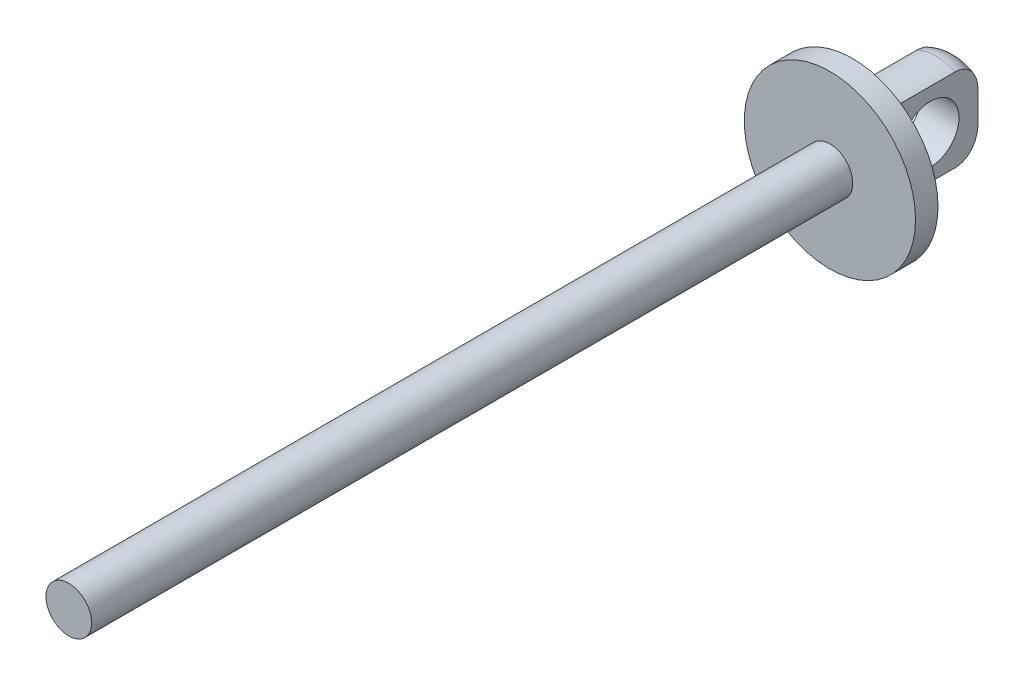
ISO-10303-21;
HEADER;
FILE_DESCRIPTION(('STEP AP214'),'2;1');
FILE_NAME('part.step','',(''),(''),'','','');
FILE_SCHEMA(('AUTOMOTIVE_DESIGN { 1 0 10303 214 1 1 1 1 }'));
ENDSEC;
DATA;
#1=APPLICATION_CONTEXT('core data for automotive mechanical design processes');
#2=APPLICATION_PROTOCOL_DEFINITION('international standard','automotive_design',2000,#1);
#3=PRODUCT_CONTEXT('',#1,'mechanical');
#4=PRODUCT('Part','Part','',(#3));
#5=PRODUCT_RELATED_PRODUCT_CATEGORY('part','',(#4));
#6=PRODUCT_DEFINITION_FORMATION('','',#4);
#7=PRODUCT_DEFINITION_CONTEXT('part definition',#1,'design');
#8=PRODUCT_DEFINITION('design','',#6,#7);
#9=PRODUCT_DEFINITION_SHAPE('','',#8);
#10=(LENGTH_UNIT() NAMED_UNIT(*) SI_UNIT(.MILLI.,.METRE.));
#11=(NAMED_UNIT(*) PLANE_ANGLE_UNIT() SI_UNIT($,.RADIAN.));
#12=(NAMED_UNIT(*) SI_UNIT($,.STERADIAN.) SOLID_ANGLE_UNIT());
#13=UNCERTAINTY_MEASURE_WITH_UNIT(LENGTH_MEASURE(1.E-05),#10,'distance_accuracy_value','');
#14=(GEOMETRIC_REPRESENTATION_CONTEXT(3) GLOBAL_UNCERTAINTY_ASSIGNED_CONTEXT((#13)) GLOBAL_UNIT_ASSIGNED_CONTEXT((#10,
#11,#12)) REPRESENTATION_CONTEXT('',''));
#15=CARTESIAN_POINT('',(0.,0.,0.));
#16=DIRECTION('',(0.,0.,1.));
#17=DIRECTION('',(1.,0.,0.));
#18=AXIS2_PLACEMENT_3D('',#15,#16,#17);
#19=CARTESIAN_POINT('',(0.,0.,-22.));
#20=DIRECTION('',(0.,0.,-1.));
#21=DIRECTION('',(-1.,0.,0.));
#22=AXIS2_PLACEMENT_3D('',#19,#20,#21);
#23=TOROIDAL_SURFACE('',#22,6.,6.);
#24=CARTESIAN_POINT('',(-5.,0.,-27.9160797830996));
#25=CARTESIAN_POINT('',(-5.,-0.210179402860169,-27.9160782233461));
#26=CARTESIAN_POINT('',(-5.,-0.420358578316598,-27.918375008018));
#27=CARTESIAN_POINT('',(-5.,-0.840639593750408,-27.9268982090566));
#28=CARTESIAN_POINT('',(-5.,-1.05074142937265,-27.9331248204162));
#29=CARTESIAN_POINT('',(-5.,-1.47112575238376,-27.9477140691546));
#30=CARTESIAN_POINT('',(-5.,-1.6814081377775,-27.9560793639158));
#31=CARTESIAN_POINT('',(-5.,-2.10198838135372,-27.9723971450416));
#32=CARTESIAN_POINT('',(-5.,-2.31228623934536,-27.9803496358471));
#33=CARTESIAN_POINT('',(-5.,-2.73247664256588,-27.9929827306491));
#34=CARTESIAN_POINT('',(-5.,-2.94236891082192,-27.9976713425671));
#35=CARTESIAN_POINT('',(-5.,-3.36223789057171,-28.0010011189846));
#36=CARTESIAN_POINT('',(-5.,-3.57221460561576,-27.9996419950178));
#37=CARTESIAN_POINT('',(-5.,-3.99158163851871,-27.9882746427171));
#38=CARTESIAN_POINT('',(-5.,-4.20097232532135,-27.9782822927078));
#39=CARTESIAN_POINT('',(-5.,-4.6189248088835,-27.9473598808071));
#40=CARTESIAN_POINT('',(-5.,-4.82748682728496,-27.9264329742763));
#41=CARTESIAN_POINT('',(-5.,-5.23070235295539,-27.8732750654598));
#42=CARTESIAN_POINT('',(-5.,-5.42545143496461,-27.8417825919331));
#43=CARTESIAN_POINT('',(-5.,-5.81254568464723,-27.7659735771322));
#44=CARTESIAN_POINT('',(-5.,-6.00488993264621,-27.7216522773567));
#45=CARTESIAN_POINT('',(-5.,-6.38604577842158,-27.6190578946037));
#46=CARTESIAN_POINT('',(-5.,-6.57485390105913,-27.560771791351));
#47=CARTESIAN_POINT('',(-5.,-6.94729075955314,-27.4294938365762));
#48=CARTESIAN_POINT('',(-5.,-7.13092013499152,-27.3565038101545));
#49=CARTESIAN_POINT('',(-5.,-7.49307835651931,-27.1946021974343));
#50=CARTESIAN_POINT('',(-5.,-7.67154490378777,-27.1055506004134));
#51=CARTESIAN_POINT('',(-5.,-8.01980157395799,-26.9118490020191));
#52=CARTESIAN_POINT('',(-5.,-8.18959283734355,-26.807201058119));
#53=CARTESIAN_POINT('',(-5.,-8.51863648203271,-26.5825198501229));
#54=CARTESIAN_POINT('',(-5.,-8.67789144828544,-26.4624903810747));
#55=CARTESIAN_POINT('',(-5.,-8.98402940559325,-26.2075680081998));
#56=CARTESIAN_POINT('',(-5.,-9.13091389982666,-26.072676914871));
#57=CARTESIAN_POINT('',(-5.,-9.3980854028813,-25.8014976484894));
#58=CARTESIAN_POINT('',(-5.,-9.51957595679846,-25.6663942022471));
#59=CARTESIAN_POINT('',(-5.,-9.74944989793809,-25.3854676200675));
#60=CARTESIAN_POINT('',(-5.,-9.85783480410021,-25.2396457295498));
#61=CARTESIAN_POINT('',(-5.,-10.0602448285799,-24.9384298376605));
#62=CARTESIAN_POINT('',(-5.,-10.1542754954119,-24.78303956763));
#63=CARTESIAN_POINT('',(-5.,-10.3269281940722,-24.4639246393561));
#64=CARTESIAN_POINT('',(-5.,-10.4055517108187,-24.300200786209));
#65=CARTESIAN_POINT('',(-5.,-10.5388703198016,-23.9838761978133));
#66=CARTESIAN_POINT('',(-5.,-10.5952299675843,-23.8319746567343));
#67=CARTESIAN_POINT('',(-5.,-10.6943951987227,-23.523814155585));
#68=CARTESIAN_POINT('',(-5.,-10.7372018562854,-23.367555541924));
#69=CARTESIAN_POINT('',(-5.,-10.8088312256837,-23.0519201314913));
#70=CARTESIAN_POINT('',(-5.,-10.837658603611,-22.8925443936772));
#71=CARTESIAN_POINT('',(-5.,-10.8810655615109,-22.5718627475131));
#72=CARTESIAN_POINT('',(-5.,-10.895645345512,-22.4105568668366));
#73=CARTESIAN_POINT('',(-5.,-10.9100847178156,-22.0944809148256));
#74=CARTESIAN_POINT('',(-5.,-10.9105698851409,-21.9397390778295));
#75=CARTESIAN_POINT('',(-5.,-10.8983945599068,-21.630720062777));
#76=CARTESIAN_POINT('',(-5.,-10.8857296911551,-21.4764430565522));
#77=CARTESIAN_POINT('',(-5.,-10.8473697441481,-21.1695782204832));
#78=CARTESIAN_POINT('',(-5.,-10.8216795662051,-21.0169897774207));
#79=CARTESIAN_POINT('',(-5.,-10.7574921588641,-20.7144723655041));
#80=CARTESIAN_POINT('',(-5.,-10.7189901368944,-20.5645444140094));
#81=CARTESIAN_POINT('',(-5.,-10.6298036674497,-20.2693691787591));
#82=CARTESIAN_POINT('',(-5.,-10.579195799439,-20.1240987344691));
#83=CARTESIAN_POINT('',(-5.,-10.4660939265916,-19.8381910567149));
#84=CARTESIAN_POINT('',(-5.,-10.4035947682019,-19.6975558632359));
#85=CARTESIAN_POINT('',(-5.,-10.2672979842434,-19.4219620237695));
#86=CARTESIAN_POINT('',(-5.,-10.193505953322,-19.2870006088857));
#87=CARTESIAN_POINT('',(-5.,-10.0352224511258,-19.0235031285996));
#88=CARTESIAN_POINT('',(-5.,-9.95073049883837,-18.8949673524231));
#89=CARTESIAN_POINT('',(-5.,-9.76943671229284,-18.6418389089242));
#90=CARTESIAN_POINT('',(-5.,-9.67237361465621,-18.5174334122037));
#91=CARTESIAN_POINT('',(-5.,-9.46857482555635,-18.2768876512164));
#92=CARTESIAN_POINT('',(-5.,-9.36184195580957,-18.1607449933357));
#93=CARTESIAN_POINT('',(-5.,-9.1394166580689,-17.9371171140561));
#94=CARTESIAN_POINT('',(-5.,-9.02371378976803,-17.8296422872212));
#95=CARTESIAN_POINT('',(-5.,-8.78439831166872,-17.6239708901133));
#96=CARTESIAN_POINT('',(-5.,-8.66078762953302,-17.5257720730024));
#97=CARTESIAN_POINT('',(-5.,-8.39820549278912,-17.3327981008995));
#98=CARTESIAN_POINT('',(-5.,-8.25875832471956,-17.2386703499281));
#99=CARTESIAN_POINT('',(-5.,-7.97301774186707,-17.0614773176517));
#100=CARTESIAN_POINT('',(-5.,-7.82672416022017,-16.9784123061629));
#101=CARTESIAN_POINT('',(-5.,-7.52868868456473,-16.8235381007661));
#102=CARTESIAN_POINT('',(-5.,-7.37695860983172,-16.7517061175713));
#103=CARTESIAN_POINT('',(-5.,-7.06879227276897,-16.6189438262969));
#104=CARTESIAN_POINT('',(-5.,-6.91235505481811,-16.5580157495572));
#105=CARTESIAN_POINT('',(-5.,-6.51708748487594,-16.4191399549476));
#106=CARTESIAN_POINT('',(-5.,-6.27592786013107,-16.3477705777559));
#107=CARTESIAN_POINT('',(-5.,-5.78813322603072,-16.2271335033626));
#108=CARTESIAN_POINT('',(-5.,-5.54149552468732,-16.1778769366385));
#109=CARTESIAN_POINT('',(-5.,-5.04385178108186,-16.0987892468023));
#110=CARTESIAN_POINT('',(-5.,-4.7928294688316,-16.0690629853838));
#111=CARTESIAN_POINT('',(-5.,-4.28951934849431,-16.0261746006215));
#112=CARTESIAN_POINT('',(-5.,-4.03723185517832,-16.0130085442959));
#113=CARTESIAN_POINT('',(-5.,-3.53426054196492,-15.9992842456936));
#114=CARTESIAN_POINT('',(-5.,-3.28357873015463,-15.9986330780619));
#115=CARTESIAN_POINT('',(-5.,-2.78229207222661,-16.0052199694717));
#116=CARTESIAN_POINT('',(-5.,-2.53168727303751,-16.0124604393981));
#117=CARTESIAN_POINT('',(-5.,-2.03053523869,-16.0299895867101));
#118=CARTESIAN_POINT('',(-5.,-1.77998803701431,-16.0402790813851));
#119=CARTESIAN_POINT('',(-5.,-1.40414077784451,-16.0545363296215));
#120=CARTESIAN_POINT('',(-5.,-1.2788646063455,-16.059092242568));
#121=CARTESIAN_POINT('',(-5.,-1.0282841210962,-16.0673330708592));
#122=CARTESIAN_POINT('',(-5.,-0.902979807675607,-16.0710179959239));
#123=CARTESIAN_POINT('',(-5.,-0.652172905625341,-16.0771314481412));
#124=CARTESIAN_POINT('',(-5.,-0.52667027465358,-16.0795583004615));
#125=CARTESIAN_POINT('',(-5.,-0.275644477627551,-16.0828953873333));
#126=CARTESIAN_POINT('',(-5.,-0.15012131162852,-16.0838056258993));
#127=CARTESIAN_POINT('',(-5.,0.100930481615591,-16.0840143569455));
#128=CARTESIAN_POINT('',(-5.,0.226459108905754,-16.0833127971489));
#129=CARTESIAN_POINT('',(-5.,0.47749796487592,-16.080371213226));
#130=CARTESIAN_POINT('',(-5.,0.603008193516239,-16.0781311858288));
#131=CARTESIAN_POINT('',(-5.,0.854039807088944,-16.0723448498761));
#132=CARTESIAN_POINT('',(-5.,0.979561181503672,-16.0687981009452));
#133=CARTESIAN_POINT('',(-5.,1.23057469364403,-16.0607741114232));
#134=CARTESIAN_POINT('',(-5.,1.35606683098736,-16.0562968592809));
#135=CARTESIAN_POINT('',(-5.,1.7325230928292,-16.042174107712));
#136=CARTESIAN_POINT('',(-5.,1.98346023487463,-16.0318378192504));
#137=CARTESIAN_POINT('',(-5.,2.37752532759907,-16.0177667421473));
#138=CARTESIAN_POINT('',(-5.,2.52061693351498,-16.0131044040068));
#139=CARTESIAN_POINT('',(-5.,2.80684379058938,-16.0055824488612));
#140=CARTESIAN_POINT('',(-5.,2.94997904105401,-16.0027228045536));
#141=CARTESIAN_POINT('',(-5.,3.37939644133686,-15.9981906636028));
#142=CARTESIAN_POINT('',(-5.,3.66575992056008,-16.0005615955349));
#143=CARTESIAN_POINT('',(-5.,4.23659003210614,-16.022616305243));
#144=CARTESIAN_POINT('',(-5.,4.52105927665598,-16.0422191630433));
#145=CARTESIAN_POINT('',(-5.,5.0876079408644,-16.1040938915869));
#146=CARTESIAN_POINT('',(-5.,5.36968807896051,-16.1463586825273));
#147=CARTESIAN_POINT('',(-5.,5.84497482451958,-16.241126375577));
#148=CARTESIAN_POINT('',(-5.,6.03954561645379,-16.2867936827537));
#149=CARTESIAN_POINT('',(-5.,6.42478570201226,-16.3924373324917));
#150=CARTESIAN_POINT('',(-5.,6.61545536755141,-16.4524123040615));
#151=CARTESIAN_POINT('',(-5.,6.99197134643485,-16.5876720448801));
#152=CARTESIAN_POINT('',(-5.,7.17780120625225,-16.6630028726915));
#153=CARTESIAN_POINT('',(-5.,7.54235254403095,-16.829325256351));
#154=CARTESIAN_POINT('',(-5.,7.72107384575582,-16.9203172001743));
#155=CARTESIAN_POINT('',(-5.,8.07105314675138,-17.1189101759717));
#156=CARTESIAN_POINT('',(-5.,8.24223610872298,-17.2266439218032));
#157=CARTESIAN_POINT('',(-5.,8.57360348836767,-17.4579249708397));
#158=CARTESIAN_POINT('',(-5.,8.73378753648996,-17.5814728049807));
#159=CARTESIAN_POINT('',(-5.,9.04096083851187,-17.8435706472845));
#160=CARTESIAN_POINT('',(-5.,9.18797046711283,-17.9820967323639));
#161=CARTESIAN_POINT('',(-5.,9.46716916290334,-18.2733511618752));
#162=CARTESIAN_POINT('',(-5.,9.59936075903579,-18.4260770747067));
#163=CARTESIAN_POINT('',(-5.,9.83011143620199,-18.7225498957652));
#164=CARTESIAN_POINT('',(-5.,9.93079600851893,-18.8646472081749));
#165=CARTESIAN_POINT('',(-5.,10.118770664695,-19.157438044865));
#166=CARTESIAN_POINT('',(-5.,10.2060621955077,-19.3081306381144));
#167=CARTESIAN_POINT('',(-5.,10.3663073833129,-19.6169379482344));
#168=CARTESIAN_POINT('',(-5.,10.4392626002391,-19.7750518552702));
#169=CARTESIAN_POINT('',(-5.,10.5700425957877,-20.0974191895737));
#170=CARTESIAN_POINT('',(-5.,10.627868222658,-20.2616722720552));
#171=CARTESIAN_POINT('',(-5.,10.7233910441731,-20.58037935157));
#172=CARTESIAN_POINT('',(-5.,10.7624027251287,-20.7344407787151));
#173=CARTESIAN_POINT('',(-5.,10.8269251795723,-21.0454236396069));
#174=CARTESIAN_POINT('',(-5.,10.8524315890263,-21.2023459808934));
#175=CARTESIAN_POINT('',(-5.,10.8896650269892,-21.5177031413837));
#176=CARTESIAN_POINT('',(-5.,10.9014018507117,-21.676136804503));
#177=CARTESIAN_POINT('',(-5.,10.9110184289174,-21.9934839747968));
#178=CARTESIAN_POINT('',(-5.,10.9088931367653,-22.152397635672));
#179=CARTESIAN_POINT('',(-5.,10.8910787228108,-22.4644591228514));
#180=CARTESIAN_POINT('',(-5.,10.8758168954402,-22.617631530404));
#181=CARTESIAN_POINT('',(-5.,10.8324302296199,-22.9222004565506));
#182=CARTESIAN_POINT('',(-5.,10.8043007422386,-23.0735963130049));
#183=CARTESIAN_POINT('',(-5.,10.7354431263624,-23.3734280512224));
#184=CARTESIAN_POINT('',(-5.,10.6947201366475,-23.5218651140717));
#185=CARTESIAN_POINT('',(-5.,10.6010120263942,-23.814887122115));
#186=CARTESIAN_POINT('',(-5.,10.5480214522745,-23.9594703220938));
#187=CARTESIAN_POINT('',(-5.,10.4300357271366,-24.2442723765943));
#188=CARTESIAN_POINT('',(-5.,10.3649971955926,-24.3844732490956));
#189=CARTESIAN_POINT('',(-5.,10.2236389969917,-24.6589898772089));
#190=CARTESIAN_POINT('',(-5.,10.1473239694406,-24.7933080238347));
#191=CARTESIAN_POINT('',(-5.,9.9840178716877,-25.0553370574767));
#192=CARTESIAN_POINT('',(-5.,9.89702378939547,-25.1830460658407));
#193=CARTESIAN_POINT('',(-5.,9.71312661529406,-25.431050733161));
#194=CARTESIAN_POINT('',(-5.,9.61622648910655,-25.5513485936458));
#195=CARTESIAN_POINT('',(-5.,9.40957902395757,-25.7881845477877));
#196=CARTESIAN_POINT('',(-5.,9.29949257390903,-25.9044266955258));
#197=CARTESIAN_POINT('',(-5.,9.07043811046334,-26.1277258155731));
#198=CARTESIAN_POINT('',(-5.,8.95147246805807,-26.2347852236352));
#199=CARTESIAN_POINT('',(-5.,8.70549042437564,-26.439399444257));
#200=CARTESIAN_POINT('',(-5.,8.57846811394027,-26.5369471442447));
#201=CARTESIAN_POINT('',(-5.,8.31745245226937,-26.7221310713565));
#202=CARTESIAN_POINT('',(-5.,8.18346074283516,-26.8097696175073));
#203=CARTESIAN_POINT('',(-5.,7.89835810386756,-26.9816913151587));
#204=CARTESIAN_POINT('',(-5.,7.7467387372317,-27.0651311429345));
#205=CARTESIAN_POINT('',(-5.,7.43762700679414,-27.2202823467777));
#206=CARTESIAN_POINT('',(-5.,7.28013440451269,-27.2919932459599));
#207=CARTESIAN_POINT('',(-5.,6.96057035859475,-27.4238038723145));
#208=CARTESIAN_POINT('',(-5.,6.79850391499163,-27.4839157556021));
#209=CARTESIAN_POINT('',(-5.,6.4706832131713,-27.5930032950033));
#210=CARTESIAN_POINT('',(-5.,6.3049286836586,-27.641978128883));
#211=CARTESIAN_POINT('',(-5.,5.85460093863885,-27.7596567071566));
#212=CARTESIAN_POINT('',(-5.,5.567411754645,-27.8184595665242));
#213=CARTESIAN_POINT('',(-5.,4.98886732288898,-27.9094689345996));
#214=CARTESIAN_POINT('',(-5.,4.69750939441355,-27.941657467715));
#215=CARTESIAN_POINT('',(-5.,4.11206300303765,-27.9847463442928));
#216=CARTESIAN_POINT('',(-5.,3.81796816491649,-27.9955521912882));
#217=CARTESIAN_POINT('',(-5.,3.22975342830413,-28.0021663916036));
#218=CARTESIAN_POINT('',(-5.,2.93563353211379,-27.997975578323));
#219=CARTESIAN_POINT('',(-5.,2.42122006865406,-27.9841413543253));
#220=CARTESIAN_POINT('',(-5.,2.20086891537143,-27.9761247183653));
#221=CARTESIAN_POINT('',(-5.,1.76019832172966,-27.9592132556223));
#222=CARTESIAN_POINT('',(-5.,1.5398788817132,-27.9503184199726));
#223=CARTESIAN_POINT('',(-5.,1.09963979056992,-27.93465755388));
#224=CARTESIAN_POINT('',(-5.,0.87972032067869,-27.9278869036476));
#225=CARTESIAN_POINT('',(-5.,0.439867124723069,-27.9185996655588));
#226=CARTESIAN_POINT('',(-5.,0.219933437861399,-27.9160814152384));
#227=CARTESIAN_POINT('',(-5.,0.,-27.9160797830996));
#228=B_SPLINE_CURVE_WITH_KNOTS('',3,(#24,#25,#26,#27,#28,#29,#30,#31,#32,#33,#34,#35,#36,#37,
#38,#39,#40,#41,#42,#43,#44,#45,#46,#47,#48,#49,#50,#51,#52,#53,#54,#55,#56,#57,#58,#59,#60,#61,
#62,#63,#64,#65,#66,#67,#68,#69,#70,#71,#72,#73,#74,#75,#76,#77,#78,#79,#80,#81,#82,#83,#84,#85,
#86,#87,#88,#89,#90,#91,#92,#93,#94,#95,#96,#97,#98,#99,#100,#101,#102,#103,#104,#105,#106,#107,
#108,#109,#110,#111,#112,#113,#114,#115,#116,#117,#118,#119,#120,#121,#122,#123,#124,#125,#126,
#127,#128,#129,#130,#131,#132,#133,#134,#135,#136,#137,#138,#139,#140,#141,#142,#143,#144,#145,
#146,#147,#148,#149,#150,#151,#152,#153,#154,#155,#156,#157,#158,#159,#160,#161,#162,#163,#164,
#165,#166,#167,#168,#169,#170,#171,#172,#173,#174,#175,#176,#177,#178,#179,#180,#181,#182,#183,
#184,#185,#186,#187,#188,#189,#190,#191,#192,#193,#194,#195,#196,#197,#198,#199,#200,#201,#202,
#203,#204,#205,#206,#207,#208,#209,#210,#211,#212,#213,#214,#215,#216,#217,#218,#219,#220,#221,
#222,#223,#224,#225,#226,#227),.UNSPECIFIED.,.T.,.F.,(4,2,2,2,2,2,2,2,2,2,2,2,2,2,2,2,2,2,2,2,2,
2,2,2,2,2,2,2,2,2,2,2,2,2,2,2,2,2,2,2,2,2,2,2,2,2,2,2,2,2,2,2,2,2,2,2,2,2,2,2,2,2,2,2,2,2,2,2,2,
2,2,2,2,2,2,2,2,2,2,2,2,2,2,2,2,2,2,2,2,2,2,2,2,2,2,2,2,2,2,2,2,4),(0.,0.630527964156358,
1.26108721676211,1.8924337998335,2.52377358958717,3.15355887635173,3.78337420310187,
4.41203362647722,5.04051173910356,5.63196711938112,6.22364216556715,6.81587102965997,
7.40802642955625,8.00561789104504,8.60313058781542,9.20049614449042,9.79778900818659,
10.342113209158,10.8863742625667,11.4304244006596,11.9744220781948,12.4598746375484,
12.9452887104046,13.4305406469923,13.9157856345725,14.3794588401509,14.8432864007208,
15.3069395919015,15.770766418813,16.2317333335293,16.6929004831225,17.1538398992531,
17.6148000441743,18.0876477226357,18.5603578620926,19.0336267030324,19.5067806131102,
20.010980003289,20.5151916884557,21.018366785867,21.5216447339526,22.2749051928443,
23.0285443812467,23.7861976240578,24.5436708932909,25.2955175930036,26.047594045308,
26.7998722739608,27.175947412517,27.5520183539628,27.9285886692604,28.3051579877686,
28.681739520039,29.0583218529602,29.4350312133295,29.8117452503965,30.5651938298537,
30.9946872929166,31.4241742509684,32.282938967066,33.1376923959801,33.9921789472627,
34.5912730440156,35.190309757313,35.7911703898142,36.3920459096675,36.9979535618712,
37.6038815619211,38.2088556905725,38.8137264126547,39.3354872522145,39.8571916821693,
40.3788393140081,40.9004576931448,41.3766436936076,41.8529834729574,42.3289841945796,
42.8051582184663,43.2664048963427,43.7278183488988,44.1890437695215,44.6504746239776,
45.1136004175265,45.5765361943673,46.0396028462966,46.5025312713906,46.9822992142765,
47.4619395009611,47.9419357412447,48.4218194150877,48.9404789860256,49.459159639851,
49.9772937126817,50.4954660262739,51.3733004598843,52.2517273087878,53.1340275943621,
54.0162788492193,54.6777686605583,55.3392651513246,55.9993128486909,56.6591024424263),.UNSPECIFIED.);
#229=CARTESIAN_POINT('',(-5.,-3.3166247903554,-28.));
#230=VERTEX_POINT('',#229);
#231=CARTESIAN_POINT('',(-5.,-10.9087121146357,-22.));
#232=VERTEX_POINT('',#231);
#233=EDGE_CURVE('E61',#230,#232,#228,.T.);
#234=ORIENTED_EDGE('',*,*,#233,.F.);
#235=CARTESIAN_POINT('',(0.,0.,-28.));
#236=DIRECTION('',(0.,0.,-1.));
#237=DIRECTION('',(-1.,0.,0.));
#238=AXIS2_PLACEMENT_3D('',#235,#236,#237);
#239=CIRCLE('',#238,6.);
#240=CARTESIAN_POINT('',(5.,-3.3166247903554,-28.));
#241=VERTEX_POINT('',#240);
#242=EDGE_CURVE('E151',#241,#230,#239,.T.);
#243=ORIENTED_EDGE('',*,*,#242,.F.);
#244=CARTESIAN_POINT('',(5.,0.,-27.9160797830996));
#245=CARTESIAN_POINT('',(5.,0.210179402860169,-27.9160782233461));
#246=CARTESIAN_POINT('',(5.,0.420358578316598,-27.918375008018));
#247=CARTESIAN_POINT('',(5.,0.840639593750408,-27.9268982090566));
#248=CARTESIAN_POINT('',(5.,1.05074142937265,-27.9331248204162));
#249=CARTESIAN_POINT('',(5.,1.47112575238376,-27.9477140691546));
#250=CARTESIAN_POINT('',(5.,1.6814081377775,-27.9560793639158));
#251=CARTESIAN_POINT('',(5.,2.10198838135372,-27.9723971450416));
#252=CARTESIAN_POINT('',(5.,2.31228623934536,-27.9803496358471));
#253=CARTESIAN_POINT('',(5.,2.73247664256588,-27.9929827306491));
#254=CARTESIAN_POINT('',(5.,2.94236891082192,-27.9976713425671));
#255=CARTESIAN_POINT('',(5.,3.36223789057171,-28.0010011189846));
#256=CARTESIAN_POINT('',(5.,3.57221460561576,-27.9996419950178));
#257=CARTESIAN_POINT('',(5.,3.99158163851871,-27.9882746427171));
#258=CARTESIAN_POINT('',(5.,4.20097232532135,-27.9782822927078));
#259=CARTESIAN_POINT('',(5.,4.6189248088835,-27.9473598808071));
#260=CARTESIAN_POINT('',(5.,4.82748682728496,-27.9264329742763));
#261=CARTESIAN_POINT('',(5.,5.23070235295539,-27.8732750654598));
#262=CARTESIAN_POINT('',(5.,5.42545143496461,-27.8417825919331));
#263=CARTESIAN_POINT('',(5.,5.81254568464723,-27.7659735771322));
#264=CARTESIAN_POINT('',(5.,6.00488993264621,-27.7216522773567));
#265=CARTESIAN_POINT('',(5.,6.38604577842158,-27.6190578946037));
#266=CARTESIAN_POINT('',(5.,6.57485390105913,-27.560771791351));
#267=CARTESIAN_POINT('',(5.,6.94729075955314,-27.4294938365762));
#268=CARTESIAN_POINT('',(5.,7.13092013499152,-27.3565038101545));
#269=CARTESIAN_POINT('',(5.,7.49307835651931,-27.1946021974343));
#270=CARTESIAN_POINT('',(5.,7.67154490378777,-27.1055506004134));
#271=CARTESIAN_POINT('',(5.,8.01980157395799,-26.9118490020191));
#272=CARTESIAN_POINT('',(5.,8.18959283734355,-26.807201058119));
#273=CARTESIAN_POINT('',(5.,8.51863648203271,-26.5825198501229));
#274=CARTESIAN_POINT('',(5.,8.67789144828544,-26.4624903810747));
#275=CARTESIAN_POINT('',(5.,8.98402940559325,-26.2075680081998));
#276=CARTESIAN_POINT('',(5.,9.13091389982666,-26.072676914871));
#277=CARTESIAN_POINT('',(5.,9.3980854028813,-25.8014976484894));
#278=CARTESIAN_POINT('',(5.,9.51957595679846,-25.6663942022471));
#279=CARTESIAN_POINT('',(5.,9.74944989793809,-25.3854676200675));
#280=CARTESIAN_POINT('',(5.,9.85783480410021,-25.2396457295498));
#281=CARTESIAN_POINT('',(5.,10.0602448285799,-24.9384298376605));
#282=CARTESIAN_POINT('',(5.,10.1542754954119,-24.78303956763));
#283=CARTESIAN_POINT('',(5.,10.3269281940722,-24.4639246393561));
#284=CARTESIAN_POINT('',(5.,10.4055517108187,-24.300200786209));
#285=CARTESIAN_POINT('',(5.,10.5388703198016,-23.9838761978133));
#286=CARTESIAN_POINT('',(5.,10.5952299675843,-23.8319746567343));
#287=CARTESIAN_POINT('',(5.,10.6943951987227,-23.523814155585));
#288=CARTESIAN_POINT('',(5.,10.7372018562854,-23.367555541924));
#289=CARTESIAN_POINT('',(5.,10.8088312256837,-23.0519201314913));
#290=CARTESIAN_POINT('',(5.,10.837658603611,-22.8925443936772));
#291=CARTESIAN_POINT('',(5.,10.8810655615109,-22.5718627475131));
#292=CARTESIAN_POINT('',(5.,10.895645345512,-22.4105568668366));
#293=CARTESIAN_POINT('',(5.,10.9100847178156,-22.0944809148256));
#294=CARTESIAN_POINT('',(5.,10.9105698851409,-21.9397390778295));
#295=CARTESIAN_POINT('',(5.,10.8983945599068,-21.630720062777));
#296=CARTESIAN_POINT('',(5.,10.8857296911551,-21.4764430565522));
#297=CARTESIAN_POINT('',(5.,10.8473697441481,-21.1695782204832));
#298=CARTESIAN_POINT('',(5.,10.8216795662051,-21.0169897774207));
#299=CARTESIAN_POINT('',(5.,10.7574921588641,-20.7144723655041));
#300=CARTESIAN_POINT('',(5.,10.7189901368944,-20.5645444140094));
#301=CARTESIAN_POINT('',(5.,10.6298036674497,-20.2693691787591));
#302=CARTESIAN_POINT('',(5.,10.579195799439,-20.1240987344691));
#303=CARTESIAN_POINT('',(5.,10.4660939265916,-19.8381910567149));
#304=CARTESIAN_POINT('',(5.,10.4035947682019,-19.6975558632359));
#305=CARTESIAN_POINT('',(5.,10.2672979842434,-19.4219620237695));
#306=CARTESIAN_POINT('',(5.,10.193505953322,-19.2870006088857));
#307=CARTESIAN_POINT('',(5.,10.0352224511258,-19.0235031285996));
#308=CARTESIAN_POINT('',(5.,9.95073049883837,-18.8949673524231));
#309=CARTESIAN_POINT('',(5.,9.76943671229284,-18.6418389089242));
#310=CARTESIAN_POINT('',(5.,9.67237361465621,-18.5174334122037));
#311=CARTESIAN_POINT('',(5.,9.46857482555635,-18.2768876512164));
#312=CARTESIAN_POINT('',(5.,9.36184195580957,-18.1607449933357));
#313=CARTESIAN_POINT('',(5.,9.1394166580689,-17.9371171140561));
#314=CARTESIAN_POINT('',(5.,9.02371378976803,-17.8296422872212));
#315=CARTESIAN_POINT('',(5.,8.78439831166872,-17.6239708901133));
#316=CARTESIAN_POINT('',(5.,8.66078762953302,-17.5257720730024));
#317=CARTESIAN_POINT('',(5.,8.39820549278912,-17.3327981008995));
#318=CARTESIAN_POINT('',(5.,8.25875832471956,-17.2386703499281));
#319=CARTESIAN_POINT('',(5.,7.97301774186707,-17.0614773176517));
#320=CARTESIAN_POINT('',(5.,7.82672416022017,-16.9784123061629));
#321=CARTESIAN_POINT('',(5.,7.52868868456473,-16.8235381007661));
#322=CARTESIAN_POINT('',(5.,7.37695860983172,-16.7517061175713));
#323=CARTESIAN_POINT('',(5.,7.06879227276897,-16.6189438262969));
#324=CARTESIAN_POINT('',(5.,6.91235505481811,-16.5580157495572));
#325=CARTESIAN_POINT('',(5.,6.51708748487594,-16.4191399549476));
#326=CARTESIAN_POINT('',(5.,6.27592786013107,-16.3477705777559));
#327=CARTESIAN_POINT('',(5.,5.78813322603072,-16.2271335033626));
#328=CARTESIAN_POINT('',(5.,5.54149552468732,-16.1778769366385));
#329=CARTESIAN_POINT('',(5.,5.04385178108186,-16.0987892468023));
#330=CARTESIAN_POINT('',(5.,4.7928294688316,-16.0690629853838));
#331=CARTESIAN_POINT('',(5.,4.28951934849431,-16.0261746006215));
#332=CARTESIAN_POINT('',(5.,4.03723185517832,-16.0130085442959));
#333=CARTESIAN_POINT('',(5.,3.53426054196492,-15.9992842456936));
#334=CARTESIAN_POINT('',(5.,3.28357873015463,-15.9986330780619));
#335=CARTESIAN_POINT('',(5.,2.78229207222661,-16.0052199694717));
#336=CARTESIAN_POINT('',(5.,2.53168727303751,-16.0124604393981));
#337=CARTESIAN_POINT('',(5.,2.03053523869,-16.0299895867101));
#338=CARTESIAN_POINT('',(5.,1.77998803701431,-16.0402790813851));
#339=CARTESIAN_POINT('',(5.,1.40414077784451,-16.0545363296215));
#340=CARTESIAN_POINT('',(5.,1.2788646063455,-16.059092242568));
#341=CARTESIAN_POINT('',(5.,1.0282841210962,-16.0673330708592));
#342=CARTESIAN_POINT('',(5.,0.902979807675607,-16.0710179959239));
#343=CARTESIAN_POINT('',(5.,0.652172905625341,-16.0771314481412));
#344=CARTESIAN_POINT('',(5.,0.52667027465358,-16.0795583004615));
#345=CARTESIAN_POINT('',(5.,0.275644477627551,-16.0828953873333));
#346=CARTESIAN_POINT('',(5.,0.15012131162852,-16.0838056258993));
#347=CARTESIAN_POINT('',(5.,-0.100930481615591,-16.0840143569455));
#348=CARTESIAN_POINT('',(5.,-0.226459108905754,-16.0833127971489));
#349=CARTESIAN_POINT('',(5.,-0.47749796487592,-16.080371213226));
#350=CARTESIAN_POINT('',(5.,-0.603008193516239,-16.0781311858288));
#351=CARTESIAN_POINT('',(5.,-0.854039807088944,-16.0723448498761));
#352=CARTESIAN_POINT('',(5.,-0.979561181503672,-16.0687981009452));
#353=CARTESIAN_POINT('',(5.,-1.23057469364403,-16.0607741114232));
#354=CARTESIAN_POINT('',(5.,-1.35606683098736,-16.0562968592809));
#355=CARTESIAN_POINT('',(5.,-1.7325230928292,-16.042174107712));
#356=CARTESIAN_POINT('',(5.,-1.98346023487463,-16.0318378192504));
#357=CARTESIAN_POINT('',(5.,-2.37752532759907,-16.0177667421473));
#358=CARTESIAN_POINT('',(5.,-2.52061693351498,-16.0131044040068));
#359=CARTESIAN_POINT('',(5.,-2.80684379058938,-16.0055824488612));
#360=CARTESIAN_POINT('',(5.,-2.94997904105401,-16.0027228045536));
#361=CARTESIAN_POINT('',(5.,-3.37939644133686,-15.9981906636028));
#362=CARTESIAN_POINT('',(5.,-3.66575992056008,-16.0005615955349));
#363=CARTESIAN_POINT('',(5.,-4.23659003210614,-16.022616305243));
#364=CARTESIAN_POINT('',(5.,-4.52105927665598,-16.0422191630433));
#365=CARTESIAN_POINT('',(5.,-5.0876079408644,-16.1040938915869));
#366=CARTESIAN_POINT('',(5.,-5.36968807896051,-16.1463586825273));
#367=CARTESIAN_POINT('',(5.,-5.84497482451958,-16.241126375577));
#368=CARTESIAN_POINT('',(5.,-6.03954561645379,-16.2867936827537));
#369=CARTESIAN_POINT('',(5.,-6.42478570201226,-16.3924373324917));
#370=CARTESIAN_POINT('',(5.,-6.61545536755141,-16.4524123040615));
#371=CARTESIAN_POINT('',(5.,-6.99197134643485,-16.5876720448801));
#372=CARTESIAN_POINT('',(5.,-7.17780120625225,-16.6630028726915));
#373=CARTESIAN_POINT('',(5.,-7.54235254403095,-16.829325256351));
#374=CARTESIAN_POINT('',(5.,-7.72107384575582,-16.9203172001743));
#375=CARTESIAN_POINT('',(5.,-8.07105314675138,-17.1189101759717));
#376=CARTESIAN_POINT('',(5.,-8.24223610872298,-17.2266439218032));
#377=CARTESIAN_POINT('',(5.,-8.57360348836767,-17.4579249708397));
#378=CARTESIAN_POINT('',(5.,-8.73378753648996,-17.5814728049807));
#379=CARTESIAN_POINT('',(5.,-9.04096083851187,-17.8435706472845));
#380=CARTESIAN_POINT('',(5.,-9.18797046711283,-17.9820967323639));
#381=CARTESIAN_POINT('',(5.,-9.46716916290334,-18.2733511618752));
#382=CARTESIAN_POINT('',(5.,-9.59936075903579,-18.4260770747067));
#383=CARTESIAN_POINT('',(5.,-9.83011143620199,-18.7225498957652));
#384=CARTESIAN_POINT('',(5.,-9.93079600851893,-18.8646472081749));
#385=CARTESIAN_POINT('',(5.,-10.118770664695,-19.157438044865));
#386=CARTESIAN_POINT('',(5.,-10.2060621955077,-19.3081306381144));
#387=CARTESIAN_POINT('',(5.,-10.3663073833129,-19.6169379482344));
#388=CARTESIAN_POINT('',(5.,-10.4392626002391,-19.7750518552702));
#389=CARTESIAN_POINT('',(5.,-10.5700425957877,-20.0974191895737));
#390=CARTESIAN_POINT('',(5.,-10.627868222658,-20.2616722720552));
#391=CARTESIAN_POINT('',(5.,-10.7233910441731,-20.58037935157));
#392=CARTESIAN_POINT('',(5.,-10.7624027251287,-20.7344407787151));
#393=CARTESIAN_POINT('',(5.,-10.8269251795723,-21.0454236396069));
#394=CARTESIAN_POINT('',(5.,-10.8524315890263,-21.2023459808934));
#395=CARTESIAN_POINT('',(5.,-10.8896650269892,-21.5177031413837));
#396=CARTESIAN_POINT('',(5.,-10.9014018507117,-21.676136804503));
#397=CARTESIAN_POINT('',(5.,-10.9110184289174,-21.9934839747968));
#398=CARTESIAN_POINT('',(5.,-10.9088931367653,-22.152397635672));
#399=CARTESIAN_POINT('',(5.,-10.8910787228108,-22.4644591228514));
#400=CARTESIAN_POINT('',(5.,-10.8758168954402,-22.617631530404));
#401=CARTESIAN_POINT('',(5.,-10.8324302296199,-22.9222004565506));
#402=CARTESIAN_POINT('',(5.,-10.8043007422386,-23.0735963130049));
#403=CARTESIAN_POINT('',(5.,-10.7354431263624,-23.3734280512224));
#404=CARTESIAN_POINT('',(5.,-10.6947201366475,-23.5218651140717));
#405=CARTESIAN_POINT('',(5.,-10.6010120263942,-23.814887122115));
#406=CARTESIAN_POINT('',(5.,-10.5480214522745,-23.9594703220938));
#407=CARTESIAN_POINT('',(5.,-10.4300357271366,-24.2442723765943));
#408=CARTESIAN_POINT('',(5.,-10.3649971955926,-24.3844732490956));
#409=CARTESIAN_POINT('',(5.,-10.2236389969917,-24.6589898772089));
#410=CARTESIAN_POINT('',(5.,-10.1473239694406,-24.7933080238347));
#411=CARTESIAN_POINT('',(5.,-9.9840178716877,-25.0553370574767));
#412=CARTESIAN_POINT('',(5.,-9.89702378939547,-25.1830460658407));
#413=CARTESIAN_POINT('',(5.,-9.71312661529406,-25.431050733161));
#414=CARTESIAN_POINT('',(5.,-9.61622648910655,-25.5513485936458));
#415=CARTESIAN_POINT('',(5.,-9.40957902395757,-25.7881845477877));
#416=CARTESIAN_POINT('',(5.,-9.29949257390903,-25.9044266955258));
#417=CARTESIAN_POINT('',(5.,-9.07043811046334,-26.1277258155731));
#418=CARTESIAN_POINT('',(5.,-8.95147246805807,-26.2347852236352));
#419=CARTESIAN_POINT('',(5.,-8.70549042437564,-26.439399444257));
#420=CARTESIAN_POINT('',(5.,-8.57846811394027,-26.5369471442447));
#421=CARTESIAN_POINT('',(5.,-8.31745245226937,-26.7221310713565));
#422=CARTESIAN_POINT('',(5.,-8.18346074283516,-26.8097696175073));
#423=CARTESIAN_POINT('',(5.,-7.89835810386756,-26.9816913151587));
#424=CARTESIAN_POINT('',(5.,-7.7467387372317,-27.0651311429345));
#425=CARTESIAN_POINT('',(5.,-7.43762700679414,-27.2202823467777));
#426=CARTESIAN_POINT('',(5.,-7.28013440451269,-27.2919932459599));
#427=CARTESIAN_POINT('',(5.,-6.96057035859475,-27.4238038723145));
#428=CARTESIAN_POINT('',(5.,-6.79850391499163,-27.4839157556021));
#429=CARTESIAN_POINT('',(5.,-6.4706832131713,-27.5930032950033));
#430=CARTESIAN_POINT('',(5.,-6.3049286836586,-27.641978128883));
#431=CARTESIAN_POINT('',(5.,-5.85460093863885,-27.7596567071566));
#432=CARTESIAN_POINT('',(5.,-5.567411754645,-27.8184595665242));
#433=CARTESIAN_POINT('',(5.,-4.98886732288898,-27.9094689345996));
#434=CARTESIAN_POINT('',(5.,-4.69750939441355,-27.941657467715));
#435=CARTESIAN_POINT('',(5.,-4.11206300303765,-27.9847463442928));
#436=CARTESIAN_POINT('',(5.,-3.81796816491649,-27.9955521912882));
#437=CARTESIAN_POINT('',(5.,-3.22975342830413,-28.0021663916036));
#438=CARTESIAN_POINT('',(5.,-2.93563353211379,-27.997975578323));
#439=CARTESIAN_POINT('',(5.,-2.42122006865406,-27.9841413543253));
#440=CARTESIAN_POINT('',(5.,-2.20086891537143,-27.9761247183653));
#441=CARTESIAN_POINT('',(5.,-1.76019832172966,-27.9592132556223));
#442=CARTESIAN_POINT('',(5.,-1.5398788817132,-27.9503184199726));
#443=CARTESIAN_POINT('',(5.,-1.09963979056992,-27.93465755388));
#444=CARTESIAN_POINT('',(5.,-0.87972032067869,-27.9278869036476));
#445=CARTESIAN_POINT('',(5.,-0.439867124723069,-27.9185996655588));
#446=CARTESIAN_POINT('',(5.,-0.219933437861399,-27.9160814152384));
#447=CARTESIAN_POINT('',(5.,0.,-27.9160797830996));
#448=B_SPLINE_CURVE_WITH_KNOTS('',3,(#244,#245,#246,#247,#248,#249,#250,#251,#252,#253,#254,
#255,#256,#257,#258,#259,#260,#261,#262,#263,#264,#265,#266,#267,#268,#269,#270,#271,#272,#273,
#274,#275,#276,#277,#278,#279,#280,#281,#282,#283,#284,#285,#286,#287,#288,#289,#290,#291,#292,
#293,#294,#295,#296,#297,#298,#299,#300,#301,#302,#303,#304,#305,#306,#307,#308,#309,#310,#311,
#312,#313,#314,#315,#316,#317,#318,#319,#320,#321,#322,#323,#324,#325,#326,#327,#328,#329,#330,
#331,#332,#333,#334,#335,#336,#337,#338,#339,#340,#341,#342,#343,#344,#345,#346,#347,#348,#349,
#350,#351,#352,#353,#354,#355,#356,#357,#358,#359,#360,#361,#362,#363,#364,#365,#366,#367,#368,
#369,#370,#371,#372,#373,#374,#375,#376,#377,#378,#379,#380,#381,#382,#383,#384,#385,#386,#387,
#388,#389,#390,#391,#392,#393,#394,#395,#396,#397,#398,#399,#400,#401,#402,#403,#404,#405,#406,
#407,#408,#409,#410,#411,#412,#413,#414,#415,#416,#417,#418,#419,#420,#421,#422,#423,#424,#425,
#426,#427,#428,#429,#430,#431,#432,#433,#434,#435,#436,#437,#438,#439,#440,#441,#442,#443,#444,
#445,#446,#447),.UNSPECIFIED.,.T.,.F.,(4,2,2,2,2,2,2,2,2,2,2,2,2,2,2,2,2,2,2,2,2,2,2,2,2,2,2,2,
2,2,2,2,2,2,2,2,2,2,2,2,2,2,2,2,2,2,2,2,2,2,2,2,2,2,2,2,2,2,2,2,2,2,2,2,2,2,2,2,2,2,2,2,2,2,2,2,
2,2,2,2,2,2,2,2,2,2,2,2,2,2,2,2,2,2,2,2,2,2,2,2,2,4),(0.,0.630527964156358,1.26108721676211,
1.8924337998335,2.52377358958717,3.15355887635173,3.78337420310187,4.41203362647722,
5.04051173910356,5.63196711938112,6.22364216556715,6.81587102965997,7.40802642955625,
8.00561789104504,8.60313058781542,9.20049614449042,9.79778900818659,10.342113209158,
10.8863742625667,11.4304244006596,11.9744220781948,12.4598746375484,12.9452887104046,
13.4305406469923,13.9157856345725,14.3794588401509,14.8432864007208,15.3069395919015,
15.770766418813,16.2317333335293,16.6929004831225,17.1538398992531,17.6148000441743,
18.0876477226357,18.5603578620926,19.0336267030324,19.5067806131102,20.010980003289,
20.5151916884557,21.018366785867,21.5216447339526,22.2749051928443,23.0285443812467,
23.7861976240578,24.5436708932909,25.2955175930036,26.047594045308,26.7998722739608,
27.175947412517,27.5520183539628,27.9285886692604,28.3051579877686,28.681739520039,
29.0583218529602,29.4350312133295,29.8117452503965,30.5651938298537,30.9946872929166,
31.4241742509684,32.282938967066,33.1376923959801,33.9921789472627,34.5912730440156,
35.190309757313,35.7911703898142,36.3920459096675,36.9979535618712,37.6038815619211,
38.2088556905725,38.8137264126547,39.3354872522145,39.8571916821693,40.3788393140081,
40.9004576931448,41.3766436936076,41.8529834729574,42.3289841945796,42.8051582184663,
43.2664048963427,43.7278183488988,44.1890437695215,44.6504746239776,45.1136004175265,
45.5765361943673,46.0396028462966,46.5025312713906,46.9822992142765,47.4619395009611,
47.9419357412447,48.4218194150877,48.9404789860256,49.459159639851,49.9772937126817,
50.4954660262739,51.3733004598843,52.2517273087878,53.1340275943621,54.0162788492193,
54.6777686605583,55.3392651513246,55.9993128486909,56.6591024424263),.UNSPECIFIED.);
#449=CARTESIAN_POINT('',(5.,-10.9087121146357,-22.));
#450=VERTEX_POINT('',#449);
#451=EDGE_CURVE('E155',#450,#241,#448,.T.);
#452=ORIENTED_EDGE('',*,*,#451,.F.);
#453=CARTESIAN_POINT('',(0.,0.,-22.));
#454=DIRECTION('',(0.,0.,-1.));
#455=DIRECTION('',(-1.,0.,0.));
#456=AXIS2_PLACEMENT_3D('',#453,#454,#455);
#457=CIRCLE('',#456,12.);
#458=EDGE_CURVE('E76',#232,#450,#457,.F.);
#459=ORIENTED_EDGE('',*,*,#458,.F.);
#460=EDGE_LOOP('',(#234,#243,#452,#459));
#461=FACE_BOUND('',#460,.T.);
#462=ADVANCED_FACE('F51',(#461),#23,.T.);
#463=CARTESIAN_POINT('',(0.,0.,5.91));
#464=DIRECTION('',(0.,0.,-1.));
#465=DIRECTION('',(-1.,0.,0.));
#466=AXIS2_PLACEMENT_3D('',#463,#464,#465);
#467=CYLINDRICAL_SURFACE('',#466,22.5);
#468=CARTESIAN_POINT('',(0.,0.,5.91));
#469=DIRECTION('',(0.,0.,1.));
#470=DIRECTION('',(1.,0.,0.));
#471=AXIS2_PLACEMENT_3D('',#468,#469,#470);
#472=CIRCLE('',#471,22.5);
#473=CARTESIAN_POINT('',(22.5,0.,5.91));
#474=VERTEX_POINT('',#473);
#475=EDGE_CURVE('E142',#474,#474,#472,.T.);
#476=ORIENTED_EDGE('',*,*,#475,.F.);
#477=EDGE_LOOP('',(#476));
#478=FACE_BOUND('',#477,.T.);
#479=CARTESIAN_POINT('',(0.,0.,0.));
#480=DIRECTION('',(0.,0.,1.));
#481=DIRECTION('',(1.,0.,0.));
#482=AXIS2_PLACEMENT_3D('',#479,#480,#481);
#483=CIRCLE('',#482,22.5);
#484=CARTESIAN_POINT('',(22.5,0.,0.));
#485=VERTEX_POINT('',#484);
#486=EDGE_CURVE('E139',#485,#485,#483,.T.);
#487=ORIENTED_EDGE('',*,*,#486,.T.);
#488=EDGE_LOOP('',(#487));
#489=FACE_BOUND('',#488,.T.);
#490=ADVANCED_FACE('F190',(#478,#489),#467,.T.);
#491=CARTESIAN_POINT('',(0.,0.,5.91));
#492=DIRECTION('',(0.,0.,1.));
#493=DIRECTION('',(1.,0.,0.));
#494=AXIS2_PLACEMENT_3D('',#491,#492,#493);
#495=PLANE('',#494);
#496=CARTESIAN_POINT('',(0.,0.,5.91));
#497=DIRECTION('',(0.,0.,1.));
#498=DIRECTION('',(1.,0.,0.));
#499=AXIS2_PLACEMENT_3D('',#496,#497,#498);
#500=CIRCLE('',#499,6.);
#501=CARTESIAN_POINT('',(6.,0.,5.91));
#502=VERTEX_POINT('',#501);
#503=EDGE_CURVE('E135',#502,#502,#500,.T.);
#504=ORIENTED_EDGE('',*,*,#503,.F.);
#505=EDGE_LOOP('',(#504));
#506=FACE_BOUND('',#505,.T.);
#507=ORIENTED_EDGE('',*,*,#475,.T.);
#508=EDGE_LOOP('',(#507));
#509=FACE_BOUND('',#508,.T.);
#510=ADVANCED_FACE('F187',(#506,#509),#495,.T.);
#511=CARTESIAN_POINT('',(0.,0.,0.));
#512=DIRECTION('',(0.,0.,1.));
#513=DIRECTION('',(1.,0.,0.));
#514=AXIS2_PLACEMENT_3D('',#511,#512,#513);
#515=PLANE('',#514);
#516=CARTESIAN_POINT('',(0.,0.,0.));
#517=DIRECTION('',(0.,0.,1.));
#518=DIRECTION('',(1.,0.,0.));
#519=AXIS2_PLACEMENT_3D('',#516,#517,#518);
#520=CIRCLE('',#519,12.);
#521=CARTESIAN_POINT('',(12.,0.,0.));
#522=VERTEX_POINT('',#521);
#523=EDGE_CURVE('E145',#522,#522,#520,.F.);
#524=ORIENTED_EDGE('',*,*,#523,.F.);
#525=EDGE_LOOP('',(#524));
#526=FACE_BOUND('',#525,.T.);
#527=ORIENTED_EDGE('',*,*,#486,.F.);
#528=EDGE_LOOP('',(#527));
#529=FACE_BOUND('',#528,.T.);
#530=ADVANCED_FACE('F185',(#526,#529),#515,.F.);
#531=CARTESIAN_POINT('',(0.,0.,205.91));
#532=DIRECTION('',(0.,0.,-1.));
#533=DIRECTION('',(-1.,0.,0.));
#534=AXIS2_PLACEMENT_3D('',#531,#532,#533);
#535=CYLINDRICAL_SURFACE('',#534,6.);
#536=CARTESIAN_POINT('',(0.,0.,205.91));
#537=DIRECTION('',(0.,0.,1.));
#538=DIRECTION('',(1.,0.,0.));
#539=AXIS2_PLACEMENT_3D('',#536,#537,#538);
#540=CIRCLE('',#539,6.);
#541=CARTESIAN_POINT('',(6.,0.,205.91));
#542=VERTEX_POINT('',#541);
#543=EDGE_CURVE('E136',#542,#542,#540,.T.);
#544=ORIENTED_EDGE('',*,*,#543,.F.);
#545=EDGE_LOOP('',(#544));
#546=FACE_BOUND('',#545,.T.);
#547=ORIENTED_EDGE('',*,*,#503,.T.);
#548=EDGE_LOOP('',(#547));
#549=FACE_BOUND('',#548,.T.);
#550=ADVANCED_FACE('F181',(#546,#549),#535,.T.);
#551=CARTESIAN_POINT('',(0.,0.,205.91));
#552=DIRECTION('',(0.,0.,1.));
#553=DIRECTION('',(1.,0.,0.));
#554=AXIS2_PLACEMENT_3D('',#551,#552,#553);
#555=PLANE('',#554);
#556=ORIENTED_EDGE('',*,*,#543,.T.);
#557=EDGE_LOOP('',(#556));
#558=FACE_BOUND('',#557,.T.);
#559=ADVANCED_FACE('F178',(#558),#555,.T.);
#560=CARTESIAN_POINT('',(0.,0.,-28.));
#561=DIRECTION('',(0.,0.,1.));
#562=DIRECTION('',(1.,0.,0.));
#563=AXIS2_PLACEMENT_3D('',#560,#561,#562);
#564=CYLINDRICAL_SURFACE('',#563,12.);
#565=CARTESIAN_POINT('',(5.,10.9087121146357,-22.));
#566=VERTEX_POINT('',#565);
#567=CARTESIAN_POINT('',(-5.,10.9087121146357,-22.));
#568=VERTEX_POINT('',#567);
#569=EDGE_CURVE('E122',#566,#568,#457,.F.);
#570=ORIENTED_EDGE('',*,*,#569,.T.);
#571=DIRECTION('',(0.,0.,1.));
#572=VECTOR('',#571,1.);
#573=CARTESIAN_POINT('',(-5.,10.9087121146357,-28.));
#574=LINE('',#573,#572);
#575=CARTESIAN_POINT('',(-5.,10.9087121146357,-3.));
#576=VERTEX_POINT('',#575);
#577=EDGE_CURVE('E68',#568,#576,#574,.T.);
#578=ORIENTED_EDGE('',*,*,#577,.T.);
#579=CARTESIAN_POINT('',(0.,0.,-3.));
#580=DIRECTION('',(0.,0.,1.));
#581=DIRECTION('',(1.,0.,0.));
#582=AXIS2_PLACEMENT_3D('',#579,#580,#581);
#583=CIRCLE('',#582,12.);
#584=CARTESIAN_POINT('',(-5.,-10.9087121146357,-3.));
#585=VERTEX_POINT('',#584);
#586=EDGE_CURVE('E12',#576,#585,#583,.T.);
#587=ORIENTED_EDGE('',*,*,#586,.T.);
#588=DIRECTION('',(0.,0.,1.));
#589=VECTOR('',#588,1.);
#590=CARTESIAN_POINT('',(-5.,-10.9087121146357,-28.));
#591=LINE('',#590,#589);
#592=EDGE_CURVE('E106',#585,#232,#591,.F.);
#593=ORIENTED_EDGE('',*,*,#592,.T.);
#594=ORIENTED_EDGE('',*,*,#458,.T.);
#595=DIRECTION('',(0.,0.,1.));
#596=VECTOR('',#595,1.);
#597=CARTESIAN_POINT('',(5.,-10.9087121146357,-28.));
#598=LINE('',#597,#596);
#599=CARTESIAN_POINT('',(5.,-10.9087121146357,-3.));
#600=VERTEX_POINT('',#599);
#601=EDGE_CURVE('E131',#450,#600,#598,.T.);
#602=ORIENTED_EDGE('',*,*,#601,.T.);
#603=CARTESIAN_POINT('',(0.,0.,-3.));
#604=DIRECTION('',(0.,0.,1.));
#605=DIRECTION('',(1.,0.,0.));
#606=AXIS2_PLACEMENT_3D('',#603,#604,#605);
#607=CIRCLE('',#606,12.);
#608=CARTESIAN_POINT('',(5.,10.9087121146357,-3.));
#609=VERTEX_POINT('',#608);
#610=EDGE_CURVE('E162',#600,#609,#607,.T.);
#611=ORIENTED_EDGE('',*,*,#610,.T.);
#612=DIRECTION('',(0.,0.,1.));
#613=VECTOR('',#612,1.);
#614=CARTESIAN_POINT('',(5.,10.9087121146357,-28.));
#615=LINE('',#614,#613);
#616=EDGE_CURVE('E133',#609,#566,#615,.F.);
#617=ORIENTED_EDGE('',*,*,#616,.T.);
#618=EDGE_LOOP('',(#570,#578,#587,#593,#594,#602,#611,#617));
#619=FACE_BOUND('',#618,.T.);
#620=ORIENTED_EDGE('',*,*,#523,.T.);
#621=EDGE_LOOP('',(#620));
#622=FACE_BOUND('',#621,.T.);
#623=ADVANCED_FACE('F118',(#619,#622),#564,.T.);
#624=CARTESIAN_POINT('',(0.,0.,-28.));
#625=DIRECTION('',(0.,0.,-1.));
#626=DIRECTION('',(-1.,0.,0.));
#627=AXIS2_PLACEMENT_3D('',#624,#625,#626);
#628=PLANE('',#627);
#629=DIRECTION('',(0.,-1.,0.));
#630=VECTOR('',#629,1.);
#631=CARTESIAN_POINT('',(-5.,0.,-28.));
#632=LINE('',#631,#630);
#633=CARTESIAN_POINT('',(-5.,3.3166247903554,-28.));
#634=VERTEX_POINT('',#633);
#635=EDGE_CURVE('E115',#634,#230,#632,.T.);
#636=ORIENTED_EDGE('',*,*,#635,.F.);
#637=CARTESIAN_POINT('',(5.,3.3166247903554,-28.));
#638=VERTEX_POINT('',#637);
#639=EDGE_CURVE('E150',#634,#638,#239,.T.);
#640=ORIENTED_EDGE('',*,*,#639,.T.);
#641=DIRECTION('',(0.,1.,0.));
#642=VECTOR('',#641,1.);
#643=CARTESIAN_POINT('',(5.,0.,-28.));
#644=LINE('',#643,#642);
#645=EDGE_CURVE('E128',#241,#638,#644,.T.);
#646=ORIENTED_EDGE('',*,*,#645,.F.);
#647=ORIENTED_EDGE('',*,*,#242,.T.);
#648=EDGE_LOOP('',(#636,#640,#646,#647));
#649=FACE_BOUND('',#648,.T.);
#650=ADVANCED_FACE('F172',(#649),#628,.T.);
#651=EDGE_CURVE('E214',#568,#634,#228,.T.);
#652=ORIENTED_EDGE('',*,*,#651,.F.);
#653=ORIENTED_EDGE('',*,*,#569,.F.);
#654=EDGE_CURVE('E161',#638,#566,#448,.T.);
#655=ORIENTED_EDGE('',*,*,#654,.F.);
#656=ORIENTED_EDGE('',*,*,#639,.F.);
#657=EDGE_LOOP('',(#652,#653,#655,#656));
#658=FACE_BOUND('',#657,.T.);
#659=ADVANCED_FACE('F53',(#658),#23,.T.);
#660=CARTESIAN_POINT('',(5.,-22.5,-3.));
#661=DIRECTION('',(0.,0.,1.));
#662=DIRECTION('',(1.,0.,0.));
#663=AXIS2_PLACEMENT_3D('',#660,#661,#662);
#664=PLANE('',#663);
#665=DIRECTION('',(0.,1.,0.));
#666=VECTOR('',#665,1.);
#667=CARTESIAN_POINT('',(5.,-22.5,-3.));
#668=LINE('',#667,#666);
#669=EDGE_CURVE('E111',#600,#609,#668,.T.);
#670=ORIENTED_EDGE('',*,*,#669,.T.);
#671=ORIENTED_EDGE('',*,*,#610,.F.);
#672=EDGE_LOOP('',(#670,#671));
#673=FACE_BOUND('',#672,.T.);
#674=ADVANCED_FACE('F169',(#673),#664,.F.);
#675=CARTESIAN_POINT('',(5.,-22.5,-3.));
#676=DIRECTION('',(-1.,0.,0.));
#677=DIRECTION('',(0.,0.,1.));
#678=AXIS2_PLACEMENT_3D('',#675,#676,#677);
#679=PLANE('',#678);
#680=CARTESIAN_POINT('',(5.,0.,-15.5));
#681=DIRECTION('',(1.,0.,0.));
#682=DIRECTION('',(0.,0.,-1.));
#683=AXIS2_PLACEMENT_3D('',#680,#681,#682);
#684=CIRCLE('',#683,7.5);
#685=CARTESIAN_POINT('',(5.,0.,-23.));
#686=VERTEX_POINT('',#685);
#687=EDGE_CURVE('E336',#686,#686,#684,.T.);
#688=ORIENTED_EDGE('',*,*,#687,.F.);
#689=EDGE_LOOP('',(#688));
#690=FACE_BOUND('',#689,.T.);
#691=ORIENTED_EDGE('',*,*,#669,.F.);
#692=ORIENTED_EDGE('',*,*,#601,.F.);
#693=ORIENTED_EDGE('',*,*,#451,.T.);
#694=ORIENTED_EDGE('',*,*,#645,.T.);
#695=ORIENTED_EDGE('',*,*,#654,.T.);
#696=ORIENTED_EDGE('',*,*,#616,.F.);
#697=EDGE_LOOP('',(#691,#692,#693,#694,#695,#696));
#698=FACE_BOUND('',#697,.T.);
#699=ADVANCED_FACE('F164',(#690,#698),#679,.F.);
#700=CARTESIAN_POINT('',(-5.,-22.5,-3.));
#701=DIRECTION('',(0.,0.,1.));
#702=DIRECTION('',(1.,0.,0.));
#703=AXIS2_PLACEMENT_3D('',#700,#701,#702);
#704=PLANE('',#703);
#705=DIRECTION('',(0.,1.,0.));
#706=VECTOR('',#705,1.);
#707=CARTESIAN_POINT('',(-5.,-22.5,-3.));
#708=LINE('',#707,#706);
#709=EDGE_CURVE('E109',#585,#576,#708,.T.);
#710=ORIENTED_EDGE('',*,*,#709,.F.);
#711=ORIENTED_EDGE('',*,*,#586,.F.);
#712=EDGE_LOOP('',(#710,#711));
#713=FACE_BOUND('',#712,.T.);
#714=ADVANCED_FACE('F114',(#713),#704,.F.);
#715=CARTESIAN_POINT('',(-5.,-22.5,-3.));
#716=DIRECTION('',(1.,0.,0.));
#717=DIRECTION('',(0.,0.,-1.));
#718=AXIS2_PLACEMENT_3D('',#715,#716,#717);
#719=PLANE('',#718);
#720=CARTESIAN_POINT('',(-5.,0.,-15.5));
#721=DIRECTION('',(1.,0.,0.));
#722=DIRECTION('',(0.,0.,-1.));
#723=AXIS2_PLACEMENT_3D('',#720,#721,#722);
#724=CIRCLE('',#723,7.5);
#725=CARTESIAN_POINT('',(-5.,0.,-23.));
#726=VERTEX_POINT('',#725);
#727=EDGE_CURVE('E56',#726,#726,#724,.T.);
#728=ORIENTED_EDGE('',*,*,#727,.T.);
#729=EDGE_LOOP('',(#728));
#730=FACE_BOUND('',#729,.T.);
#731=ORIENTED_EDGE('',*,*,#709,.T.);
#732=ORIENTED_EDGE('',*,*,#577,.F.);
#733=ORIENTED_EDGE('',*,*,#651,.T.);
#734=ORIENTED_EDGE('',*,*,#635,.T.);
#735=ORIENTED_EDGE('',*,*,#233,.T.);
#736=ORIENTED_EDGE('',*,*,#592,.F.);
#737=EDGE_LOOP('',(#731,#732,#733,#734,#735,#736));
#738=FACE_BOUND('',#737,.T.);
#739=ADVANCED_FACE('F108',(#730,#738),#719,.F.);
#740=CARTESIAN_POINT('',(-22.5,0.,-15.5));
#741=DIRECTION('',(1.,0.,0.));
#742=DIRECTION('',(0.,0.,-1.));
#743=AXIS2_PLACEMENT_3D('',#740,#741,#742);
#744=CYLINDRICAL_SURFACE('',#743,7.5);
#745=ORIENTED_EDGE('',*,*,#687,.T.);
#746=EDGE_LOOP('',(#745));
#747=FACE_BOUND('',#746,.T.);
#748=ORIENTED_EDGE('',*,*,#727,.F.);
#749=EDGE_LOOP('',(#748));
#750=FACE_BOUND('',#749,.T.);
#751=ADVANCED_FACE('F225',(#747,#750),#744,.F.);
#752=CLOSED_SHELL('',(#462,#490,#510,#530,#550,#559,#623,#650,#659,#674,#699,#714,#739,#751));
#753=MANIFOLD_SOLID_BREP('B2',#752);
#754=ADVANCED_BREP_SHAPE_REPRESENTATION('',(#18,#753),#14);
#755=SHAPE_DEFINITION_REPRESENTATION(#9,#754);
ENDSEC;
END-ISO-10303-21;
